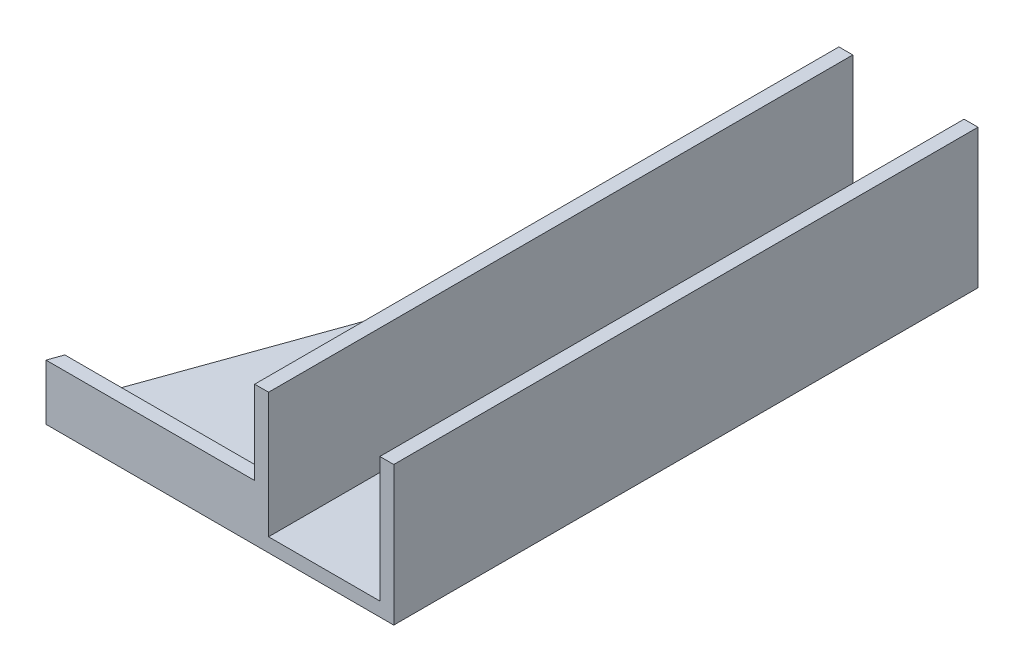
ISO-10303-21;
HEADER;
FILE_DESCRIPTION(('STEP AP214'),'2;1');
FILE_NAME('part.step','',(''),(''),'','','');
FILE_SCHEMA(('AUTOMOTIVE_DESIGN { 1 0 10303 214 1 1 1 1 }'));
ENDSEC;
DATA;
#1=APPLICATION_CONTEXT('core data for automotive mechanical design processes');
#2=APPLICATION_PROTOCOL_DEFINITION('international standard','automotive_design',2000,#1);
#3=PRODUCT_CONTEXT('',#1,'mechanical');
#4=PRODUCT('Part','Part','',(#3));
#5=PRODUCT_RELATED_PRODUCT_CATEGORY('part','',(#4));
#6=PRODUCT_DEFINITION_FORMATION('','',#4);
#7=PRODUCT_DEFINITION_CONTEXT('part definition',#1,'design');
#8=PRODUCT_DEFINITION('design','',#6,#7);
#9=PRODUCT_DEFINITION_SHAPE('','',#8);
#10=(LENGTH_UNIT() NAMED_UNIT(*) SI_UNIT(.MILLI.,.METRE.));
#11=(NAMED_UNIT(*) PLANE_ANGLE_UNIT() SI_UNIT($,.RADIAN.));
#12=(NAMED_UNIT(*) SI_UNIT($,.STERADIAN.) SOLID_ANGLE_UNIT());
#13=UNCERTAINTY_MEASURE_WITH_UNIT(LENGTH_MEASURE(1.E-05),#10,'distance_accuracy_value','');
#14=(GEOMETRIC_REPRESENTATION_CONTEXT(3) GLOBAL_UNCERTAINTY_ASSIGNED_CONTEXT((#13)) GLOBAL_UNIT_ASSIGNED_CONTEXT((#10,
#11,#12)) REPRESENTATION_CONTEXT('',''));
#15=CARTESIAN_POINT('',(0.,0.,0.));
#16=DIRECTION('',(0.,0.,1.));
#17=DIRECTION('',(1.,0.,0.));
#18=AXIS2_PLACEMENT_3D('',#15,#16,#17);
#19=CARTESIAN_POINT('',(0.,50.,0.));
#20=DIRECTION('',(0.,-1.,0.));
#21=DIRECTION('',(0.,0.,-1.));
#22=AXIS2_PLACEMENT_3D('',#19,#20,#21);
#23=PLANE('',#22);
#24=DIRECTION('',(1.,0.,0.));
#25=VECTOR('',#24,1.);
#26=CARTESIAN_POINT('',(37.5,50.,-105.));
#27=LINE('',#26,#25);
#28=CARTESIAN_POINT('',(82.5,50.,-105.));
#29=VERTEX_POINT('',#28);
#30=CARTESIAN_POINT('',(87.5,50.,-105.));
#31=VERTEX_POINT('',#30);
#32=EDGE_CURVE('E177',#29,#31,#27,.T.);
#33=ORIENTED_EDGE('',*,*,#32,.F.);
#34=DIRECTION('',(0.,0.,-1.));
#35=VECTOR('',#34,1.);
#36=CARTESIAN_POINT('',(82.5,50.,165.207972893961));
#37=LINE('',#36,#35);
#38=CARTESIAN_POINT('',(82.5,50.,105.));
#39=VERTEX_POINT('',#38);
#40=EDGE_CURVE('E143',#39,#29,#37,.T.);
#41=ORIENTED_EDGE('',*,*,#40,.F.);
#42=DIRECTION('',(-1.,0.,0.));
#43=VECTOR('',#42,1.);
#44=CARTESIAN_POINT('',(37.5,50.,105.));
#45=LINE('',#44,#43);
#46=CARTESIAN_POINT('',(87.5,50.,105.));
#47=VERTEX_POINT('',#46);
#48=EDGE_CURVE('E168',#47,#39,#45,.T.);
#49=ORIENTED_EDGE('',*,*,#48,.F.);
#50=DIRECTION('',(0.,0.,1.));
#51=VECTOR('',#50,1.);
#52=CARTESIAN_POINT('',(87.5,50.,-105.));
#53=LINE('',#52,#51);
#54=EDGE_CURVE('E181',#31,#47,#53,.T.);
#55=ORIENTED_EDGE('',*,*,#54,.F.);
#56=EDGE_LOOP('',(#33,#41,#49,#55));
#57=FACE_BOUND('',#56,.T.);
#58=ADVANCED_FACE('F39',(#57),#23,.F.);
#59=CARTESIAN_POINT('',(0.,5.,0.));
#60=DIRECTION('',(0.,-1.,0.));
#61=DIRECTION('',(0.,0.,-1.));
#62=AXIS2_PLACEMENT_3D('',#59,#60,#61);
#63=PLANE('',#62);
#64=DIRECTION('',(-1.,0.,0.));
#65=VECTOR('',#64,1.);
#66=CARTESIAN_POINT('',(-35.7142857142857,5.,100.));
#67=LINE('',#66,#65);
#68=CARTESIAN_POINT('',(37.5,5.,100.));
#69=VERTEX_POINT('',#68);
#70=CARTESIAN_POINT('',(-35.7142857142857,5.,100.));
#71=VERTEX_POINT('',#70);
#72=EDGE_CURVE('E197',#69,#71,#67,.T.);
#73=ORIENTED_EDGE('',*,*,#72,.F.);
#74=DIRECTION('',(0.,0.,-1.));
#75=VECTOR('',#74,1.);
#76=CARTESIAN_POINT('',(37.5,5.,105.));
#77=LINE('',#76,#75);
#78=CARTESIAN_POINT('',(37.5,5.,-105.));
#79=VERTEX_POINT('',#78);
#80=EDGE_CURVE('E234',#69,#79,#77,.T.);
#81=ORIENTED_EDGE('',*,*,#80,.T.);
#82=DIRECTION('',(-0.336336396998156,0.,0.941741911594837));
#83=VECTOR('',#82,1.);
#84=CARTESIAN_POINT('',(-37.5,5.,105.));
#85=LINE('',#84,#83);
#86=EDGE_CURVE('E238',#79,#71,#85,.T.);
#87=ORIENTED_EDGE('',*,*,#86,.T.);
#88=EDGE_LOOP('',(#73,#81,#87));
#89=FACE_BOUND('',#88,.T.);
#90=ADVANCED_FACE('F284',(#89),#63,.F.);
#91=CARTESIAN_POINT('',(-37.5,5.,105.));
#92=DIRECTION('',(0.941741911594837,0.,0.336336396998156));
#93=DIRECTION('',(0.336336396998156,0.,-0.941741911594837));
#94=AXIS2_PLACEMENT_3D('',#91,#92,#93);
#95=PLANE('',#94);
#96=DIRECTION('',(-0.336336396998156,0.,0.941741911594837));
#97=VECTOR('',#96,1.);
#98=CARTESIAN_POINT('',(-37.5,0.,105.));
#99=LINE('',#98,#97);
#100=CARTESIAN_POINT('',(37.5,0.,-105.));
#101=VERTEX_POINT('',#100);
#102=CARTESIAN_POINT('',(-37.5,0.,105.));
#103=VERTEX_POINT('',#102);
#104=EDGE_CURVE('E62',#101,#103,#99,.T.);
#105=ORIENTED_EDGE('',*,*,#104,.T.);
#106=DIRECTION('',(0.,-1.,0.));
#107=VECTOR('',#106,1.);
#108=CARTESIAN_POINT('',(-37.5,5.,105.));
#109=LINE('',#108,#107);
#110=CARTESIAN_POINT('',(-37.5,20.,105.));
#111=VERTEX_POINT('',#110);
#112=EDGE_CURVE('E48',#111,#103,#109,.T.);
#113=ORIENTED_EDGE('',*,*,#112,.F.);
#114=DIRECTION('',(-0.336336396998156,0.,0.941741911594838));
#115=VECTOR('',#114,1.);
#116=CARTESIAN_POINT('',(-37.5,20.,105.));
#117=LINE('',#116,#115);
#118=CARTESIAN_POINT('',(-35.7142857142857,20.,100.));
#119=VERTEX_POINT('',#118);
#120=EDGE_CURVE('E208',#119,#111,#117,.T.);
#121=ORIENTED_EDGE('',*,*,#120,.F.);
#122=DIRECTION('',(0.,-1.,0.));
#123=VECTOR('',#122,1.);
#124=CARTESIAN_POINT('',(-35.7142857142857,20.,100.));
#125=LINE('',#124,#123);
#126=EDGE_CURVE('E223',#119,#71,#125,.T.);
#127=ORIENTED_EDGE('',*,*,#126,.T.);
#128=ORIENTED_EDGE('',*,*,#86,.F.);
#129=DIRECTION('',(0.,-1.,0.));
#130=VECTOR('',#129,1.);
#131=CARTESIAN_POINT('',(37.5,5.,-105.));
#132=LINE('',#131,#130);
#133=EDGE_CURVE('E11',#79,#101,#132,.T.);
#134=ORIENTED_EDGE('',*,*,#133,.T.);
#135=EDGE_LOOP('',(#105,#113,#121,#127,#128,#134));
#136=FACE_BOUND('',#135,.T.);
#137=ADVANCED_FACE('F41',(#136),#95,.F.);
#138=CARTESIAN_POINT('',(-37.5,5.,105.));
#139=DIRECTION('',(0.,0.,-1.));
#140=DIRECTION('',(-1.,0.,0.));
#141=AXIS2_PLACEMENT_3D('',#138,#139,#140);
#142=PLANE('',#141);
#143=ORIENTED_EDGE('',*,*,#48,.T.);
#144=DIRECTION('',(0.,1.,0.));
#145=VECTOR('',#144,1.);
#146=CARTESIAN_POINT('',(82.5,4.99999999999999,105.));
#147=LINE('',#146,#145);
#148=CARTESIAN_POINT('',(82.5,4.99999999999999,105.));
#149=VERTEX_POINT('',#148);
#150=EDGE_CURVE('E167',#149,#39,#147,.T.);
#151=ORIENTED_EDGE('',*,*,#150,.F.);
#152=DIRECTION('',(1.,0.,0.));
#153=VECTOR('',#152,1.);
#154=CARTESIAN_POINT('',(42.5,5.,105.));
#155=LINE('',#154,#153);
#156=CARTESIAN_POINT('',(42.5,5.,105.));
#157=VERTEX_POINT('',#156);
#158=EDGE_CURVE('E133',#157,#149,#155,.T.);
#159=ORIENTED_EDGE('',*,*,#158,.F.);
#160=DIRECTION('',(0.,-1.,0.));
#161=VECTOR('',#160,1.);
#162=CARTESIAN_POINT('',(42.5,5.,105.));
#163=LINE('',#162,#161);
#164=CARTESIAN_POINT('',(42.5,50.,105.));
#165=VERTEX_POINT('',#164);
#166=EDGE_CURVE('E158',#165,#157,#163,.T.);
#167=ORIENTED_EDGE('',*,*,#166,.F.);
#168=CARTESIAN_POINT('',(37.5,50.,105.));
#169=VERTEX_POINT('',#168);
#170=EDGE_CURVE('E173',#165,#169,#45,.T.);
#171=ORIENTED_EDGE('',*,*,#170,.T.);
#172=DIRECTION('',(0.,-1.,0.));
#173=VECTOR('',#172,1.);
#174=CARTESIAN_POINT('',(37.5,50.,105.));
#175=LINE('',#174,#173);
#176=CARTESIAN_POINT('',(37.5,20.,105.));
#177=VERTEX_POINT('',#176);
#178=EDGE_CURVE('E185',#169,#177,#175,.T.);
#179=ORIENTED_EDGE('',*,*,#178,.T.);
#180=DIRECTION('',(1.,0.,0.));
#181=VECTOR('',#180,1.);
#182=CARTESIAN_POINT('',(-37.5,20.,105.));
#183=LINE('',#182,#181);
#184=EDGE_CURVE('E212',#111,#177,#183,.T.);
#185=ORIENTED_EDGE('',*,*,#184,.F.);
#186=ORIENTED_EDGE('',*,*,#112,.T.);
#187=DIRECTION('',(1.,0.,0.));
#188=VECTOR('',#187,1.);
#189=CARTESIAN_POINT('',(-37.5,0.,105.));
#190=LINE('',#189,#188);
#191=CARTESIAN_POINT('',(87.5,0.,105.));
#192=VERTEX_POINT('',#191);
#193=EDGE_CURVE('E239',#103,#192,#190,.T.);
#194=ORIENTED_EDGE('',*,*,#193,.T.);
#195=DIRECTION('',(0.,-1.,0.));
#196=VECTOR('',#195,1.);
#197=CARTESIAN_POINT('',(87.5,50.,105.));
#198=LINE('',#197,#196);
#199=EDGE_CURVE('E193',#47,#192,#198,.T.);
#200=ORIENTED_EDGE('',*,*,#199,.F.);
#201=EDGE_LOOP('',(#143,#151,#159,#167,#171,#179,#185,#186,#194,#200));
#202=FACE_BOUND('',#201,.T.);
#203=ADVANCED_FACE('F249',(#202),#142,.F.);
#204=CARTESIAN_POINT('',(0.,0.,0.));
#205=DIRECTION('',(0.,-1.,0.));
#206=DIRECTION('',(0.,0.,-1.));
#207=AXIS2_PLACEMENT_3D('',#204,#205,#206);
#208=PLANE('',#207);
#209=ORIENTED_EDGE('',*,*,#104,.F.);
#210=DIRECTION('',(1.,0.,0.));
#211=VECTOR('',#210,1.);
#212=CARTESIAN_POINT('',(37.5,0.,-105.));
#213=LINE('',#212,#211);
#214=CARTESIAN_POINT('',(87.5,0.,-105.));
#215=VERTEX_POINT('',#214);
#216=EDGE_CURVE('E166',#101,#215,#213,.T.);
#217=ORIENTED_EDGE('',*,*,#216,.T.);
#218=DIRECTION('',(0.,0.,1.));
#219=VECTOR('',#218,1.);
#220=CARTESIAN_POINT('',(87.5,0.,-105.));
#221=LINE('',#220,#219);
#222=EDGE_CURVE('E189',#215,#192,#221,.T.);
#223=ORIENTED_EDGE('',*,*,#222,.T.);
#224=ORIENTED_EDGE('',*,*,#193,.F.);
#225=EDGE_LOOP('',(#209,#217,#223,#224));
#226=FACE_BOUND('',#225,.T.);
#227=ADVANCED_FACE('F252',(#226),#208,.T.);
#228=CARTESIAN_POINT('',(-35.7142857142857,20.,100.));
#229=DIRECTION('',(0.,0.,1.));
#230=DIRECTION('',(1.,0.,0.));
#231=AXIS2_PLACEMENT_3D('',#228,#229,#230);
#232=PLANE('',#231);
#233=ORIENTED_EDGE('',*,*,#72,.T.);
#234=ORIENTED_EDGE('',*,*,#126,.F.);
#235=DIRECTION('',(-1.,0.,0.));
#236=VECTOR('',#235,1.);
#237=CARTESIAN_POINT('',(-35.7142857142857,20.,100.));
#238=LINE('',#237,#236);
#239=CARTESIAN_POINT('',(37.5,20.,100.));
#240=VERTEX_POINT('',#239);
#241=EDGE_CURVE('E220',#240,#119,#238,.T.);
#242=ORIENTED_EDGE('',*,*,#241,.F.);
#243=DIRECTION('',(0.,-1.,0.));
#244=VECTOR('',#243,1.);
#245=CARTESIAN_POINT('',(37.5,20.,100.));
#246=LINE('',#245,#244);
#247=EDGE_CURVE('E230',#240,#69,#246,.T.);
#248=ORIENTED_EDGE('',*,*,#247,.T.);
#249=EDGE_LOOP('',(#233,#234,#242,#248));
#250=FACE_BOUND('',#249,.T.);
#251=ADVANCED_FACE('F281',(#250),#232,.F.);
#252=CARTESIAN_POINT('',(0.,20.,0.));
#253=DIRECTION('',(0.,-1.,0.));
#254=DIRECTION('',(0.,0.,-1.));
#255=AXIS2_PLACEMENT_3D('',#252,#253,#254);
#256=PLANE('',#255);
#257=ORIENTED_EDGE('',*,*,#120,.T.);
#258=ORIENTED_EDGE('',*,*,#184,.T.);
#259=DIRECTION('',(0.,0.,-1.));
#260=VECTOR('',#259,1.);
#261=CARTESIAN_POINT('',(37.5,20.,105.));
#262=LINE('',#261,#260);
#263=EDGE_CURVE('E216',#177,#240,#262,.T.);
#264=ORIENTED_EDGE('',*,*,#263,.T.);
#265=ORIENTED_EDGE('',*,*,#241,.T.);
#266=EDGE_LOOP('',(#257,#258,#264,#265));
#267=FACE_BOUND('',#266,.T.);
#268=ADVANCED_FACE('F276',(#267),#256,.F.);
#269=CARTESIAN_POINT('',(37.5,50.,-105.));
#270=DIRECTION('',(-1.,0.,0.));
#271=DIRECTION('',(0.,0.,1.));
#272=AXIS2_PLACEMENT_3D('',#269,#270,#271);
#273=PLANE('',#272);
#274=ORIENTED_EDGE('',*,*,#80,.F.);
#275=ORIENTED_EDGE('',*,*,#247,.F.);
#276=ORIENTED_EDGE('',*,*,#263,.F.);
#277=ORIENTED_EDGE('',*,*,#178,.F.);
#278=DIRECTION('',(0.,0.,-1.));
#279=VECTOR('',#278,1.);
#280=CARTESIAN_POINT('',(37.5,50.,-105.));
#281=LINE('',#280,#279);
#282=CARTESIAN_POINT('',(37.5,50.,-105.));
#283=VERTEX_POINT('',#282);
#284=EDGE_CURVE('E172',#169,#283,#281,.T.);
#285=ORIENTED_EDGE('',*,*,#284,.T.);
#286=DIRECTION('',(0.,-1.,0.));
#287=VECTOR('',#286,1.);
#288=CARTESIAN_POINT('',(37.5,50.,-105.));
#289=LINE('',#288,#287);
#290=EDGE_CURVE('E201',#283,#79,#289,.T.);
#291=ORIENTED_EDGE('',*,*,#290,.T.);
#292=EDGE_LOOP('',(#274,#275,#276,#277,#285,#291));
#293=FACE_BOUND('',#292,.T.);
#294=ADVANCED_FACE('F274',(#293),#273,.T.);
#295=CARTESIAN_POINT('',(87.5,50.,-105.));
#296=DIRECTION('',(1.,0.,0.));
#297=DIRECTION('',(0.,0.,-1.));
#298=AXIS2_PLACEMENT_3D('',#295,#296,#297);
#299=PLANE('',#298);
#300=ORIENTED_EDGE('',*,*,#222,.F.);
#301=DIRECTION('',(0.,-1.,0.));
#302=VECTOR('',#301,1.);
#303=CARTESIAN_POINT('',(87.5,50.,-105.));
#304=LINE('',#303,#302);
#305=EDGE_CURVE('E198',#31,#215,#304,.T.);
#306=ORIENTED_EDGE('',*,*,#305,.F.);
#307=ORIENTED_EDGE('',*,*,#54,.T.);
#308=ORIENTED_EDGE('',*,*,#199,.T.);
#309=EDGE_LOOP('',(#300,#306,#307,#308));
#310=FACE_BOUND('',#309,.T.);
#311=ADVANCED_FACE('F256',(#310),#299,.T.);
#312=CARTESIAN_POINT('',(37.5,50.,-105.));
#313=DIRECTION('',(0.,0.,-1.));
#314=DIRECTION('',(-1.,0.,0.));
#315=AXIS2_PLACEMENT_3D('',#312,#313,#314);
#316=PLANE('',#315);
#317=DIRECTION('',(0.,-1.,0.));
#318=VECTOR('',#317,1.);
#319=CARTESIAN_POINT('',(82.5,4.99999999999999,-105.));
#320=LINE('',#319,#318);
#321=CARTESIAN_POINT('',(82.5,4.99999999999999,-105.));
#322=VERTEX_POINT('',#321);
#323=EDGE_CURVE('E140',#29,#322,#320,.T.);
#324=ORIENTED_EDGE('',*,*,#323,.F.);
#325=ORIENTED_EDGE('',*,*,#32,.T.);
#326=ORIENTED_EDGE('',*,*,#305,.T.);
#327=ORIENTED_EDGE('',*,*,#216,.F.);
#328=ORIENTED_EDGE('',*,*,#133,.F.);
#329=ORIENTED_EDGE('',*,*,#290,.F.);
#330=CARTESIAN_POINT('',(42.5,50.,-105.));
#331=VERTEX_POINT('',#330);
#332=EDGE_CURVE('E178',#283,#331,#27,.T.);
#333=ORIENTED_EDGE('',*,*,#332,.T.);
#334=DIRECTION('',(0.,1.,0.));
#335=VECTOR('',#334,1.);
#336=CARTESIAN_POINT('',(42.5,5.,-105.));
#337=LINE('',#336,#335);
#338=CARTESIAN_POINT('',(42.5,5.,-105.));
#339=VERTEX_POINT('',#338);
#340=EDGE_CURVE('E55',#339,#331,#337,.T.);
#341=ORIENTED_EDGE('',*,*,#340,.F.);
#342=DIRECTION('',(-1.,0.,0.));
#343=VECTOR('',#342,1.);
#344=CARTESIAN_POINT('',(42.5,5.,-105.));
#345=LINE('',#344,#343);
#346=EDGE_CURVE('E131',#322,#339,#345,.T.);
#347=ORIENTED_EDGE('',*,*,#346,.F.);
#348=EDGE_LOOP('',(#324,#325,#326,#327,#328,#329,#333,#341,#347));
#349=FACE_BOUND('',#348,.T.);
#350=ADVANCED_FACE('F148',(#349),#316,.T.);
#351=ORIENTED_EDGE('',*,*,#170,.F.);
#352=DIRECTION('',(0.,0.,-1.));
#353=VECTOR('',#352,1.);
#354=CARTESIAN_POINT('',(42.5,50.,165.207972893961));
#355=LINE('',#354,#353);
#356=EDGE_CURVE('E159',#165,#331,#355,.T.);
#357=ORIENTED_EDGE('',*,*,#356,.T.);
#358=ORIENTED_EDGE('',*,*,#332,.F.);
#359=ORIENTED_EDGE('',*,*,#284,.F.);
#360=EDGE_LOOP('',(#351,#357,#358,#359));
#361=FACE_BOUND('',#360,.T.);
#362=ADVANCED_FACE('F271',(#361),#23,.F.);
#363=CARTESIAN_POINT('',(82.5,4.99999999999999,165.207972893961));
#364=DIRECTION('',(1.,0.,0.));
#365=DIRECTION('',(0.,0.,-1.));
#366=AXIS2_PLACEMENT_3D('',#363,#364,#365);
#367=PLANE('',#366);
#368=ORIENTED_EDGE('',*,*,#150,.T.);
#369=ORIENTED_EDGE('',*,*,#40,.T.);
#370=ORIENTED_EDGE('',*,*,#323,.T.);
#371=DIRECTION('',(0.,0.,-1.));
#372=VECTOR('',#371,1.);
#373=CARTESIAN_POINT('',(82.5,4.99999999999999,165.207972893961));
#374=LINE('',#373,#372);
#375=EDGE_CURVE('E126',#149,#322,#374,.T.);
#376=ORIENTED_EDGE('',*,*,#375,.F.);
#377=EDGE_LOOP('',(#368,#369,#370,#376));
#378=FACE_BOUND('',#377,.T.);
#379=ADVANCED_FACE('F141',(#378),#367,.F.);
#380=CARTESIAN_POINT('',(42.5,5.,165.207972893961));
#381=DIRECTION('',(-1.,0.,0.));
#382=DIRECTION('',(0.,0.,1.));
#383=AXIS2_PLACEMENT_3D('',#380,#381,#382);
#384=PLANE('',#383);
#385=ORIENTED_EDGE('',*,*,#166,.T.);
#386=DIRECTION('',(0.,0.,-1.));
#387=VECTOR('',#386,1.);
#388=CARTESIAN_POINT('',(42.5,5.,165.207972893961));
#389=LINE('',#388,#387);
#390=EDGE_CURVE('E137',#157,#339,#389,.T.);
#391=ORIENTED_EDGE('',*,*,#390,.T.);
#392=ORIENTED_EDGE('',*,*,#340,.T.);
#393=ORIENTED_EDGE('',*,*,#356,.F.);
#394=EDGE_LOOP('',(#385,#391,#392,#393));
#395=FACE_BOUND('',#394,.T.);
#396=ADVANCED_FACE('F266',(#395),#384,.F.);
#397=CARTESIAN_POINT('',(42.5,5.,165.207972893961));
#398=DIRECTION('',(0.,-1.,0.));
#399=DIRECTION('',(1.,0.,0.));
#400=AXIS2_PLACEMENT_3D('',#397,#398,#399);
#401=PLANE('',#400);
#402=ORIENTED_EDGE('',*,*,#158,.T.);
#403=ORIENTED_EDGE('',*,*,#375,.T.);
#404=ORIENTED_EDGE('',*,*,#346,.T.);
#405=ORIENTED_EDGE('',*,*,#390,.F.);
#406=EDGE_LOOP('',(#402,#403,#404,#405));
#407=FACE_BOUND('',#406,.T.);
#408=ADVANCED_FACE('F128',(#407),#401,.F.);
#409=CLOSED_SHELL('',(#58,#90,#137,#203,#227,#251,#268,#294,#311,#350,#362,#379,#396,#408));
#410=MANIFOLD_SOLID_BREP('B2',#409);
#411=ADVANCED_BREP_SHAPE_REPRESENTATION('',(#18,#410),#14);
#412=SHAPE_DEFINITION_REPRESENTATION(#9,#411);
ENDSEC;
END-ISO-10303-21;
